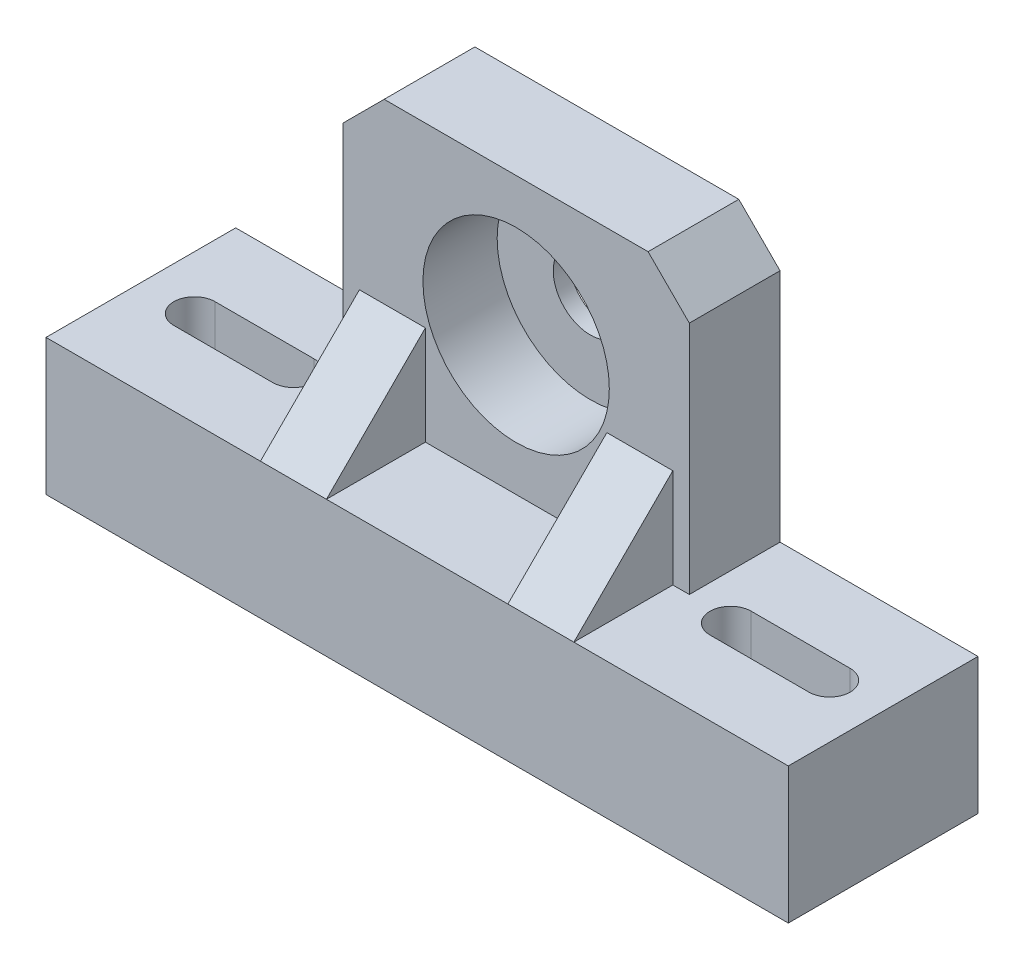
ISO-10303-21;
HEADER;
FILE_DESCRIPTION(('STEP AP214'),'2;1');
FILE_NAME('part.step','',(''),(''),'','','');
FILE_SCHEMA(('AUTOMOTIVE_DESIGN { 1 0 10303 214 1 1 1 1 }'));
ENDSEC;
DATA;
#1=APPLICATION_CONTEXT('core data for automotive mechanical design processes');
#2=APPLICATION_PROTOCOL_DEFINITION('international standard','automotive_design',2000,#1);
#3=PRODUCT_CONTEXT('',#1,'mechanical');
#4=PRODUCT('Part','Part','',(#3));
#5=PRODUCT_RELATED_PRODUCT_CATEGORY('part','',(#4));
#6=PRODUCT_DEFINITION_FORMATION('','',#4);
#7=PRODUCT_DEFINITION_CONTEXT('part definition',#1,'design');
#8=PRODUCT_DEFINITION('design','',#6,#7);
#9=PRODUCT_DEFINITION_SHAPE('','',#8);
#10=(LENGTH_UNIT() NAMED_UNIT(*) SI_UNIT(.MILLI.,.METRE.));
#11=(NAMED_UNIT(*) PLANE_ANGLE_UNIT() SI_UNIT($,.RADIAN.));
#12=(NAMED_UNIT(*) SI_UNIT($,.STERADIAN.) SOLID_ANGLE_UNIT());
#13=UNCERTAINTY_MEASURE_WITH_UNIT(LENGTH_MEASURE(1.E-05),#10,'distance_accuracy_value','');
#14=(GEOMETRIC_REPRESENTATION_CONTEXT(3) GLOBAL_UNCERTAINTY_ASSIGNED_CONTEXT((#13)) GLOBAL_UNIT_ASSIGNED_CONTEXT((#10,
#11,#12)) REPRESENTATION_CONTEXT('',''));
#15=CARTESIAN_POINT('',(0.,0.,0.));
#16=DIRECTION('',(0.,0.,1.));
#17=DIRECTION('',(1.,0.,0.));
#18=AXIS2_PLACEMENT_3D('',#15,#16,#17);
#19=CARTESIAN_POINT('',(0.,0.,-6.5));
#20=DIRECTION('',(0.,0.,1.));
#21=DIRECTION('',(1.,0.,0.));
#22=AXIS2_PLACEMENT_3D('',#19,#20,#21);
#23=CYLINDRICAL_SURFACE('',#22,4.5);
#24=CARTESIAN_POINT('',(0.,0.,-5.5));
#25=DIRECTION('',(0.,0.,1.));
#26=DIRECTION('',(1.,0.,0.));
#27=AXIS2_PLACEMENT_3D('',#24,#25,#26);
#28=CIRCLE('',#27,4.5);
#29=CARTESIAN_POINT('',(4.5,0.,-5.5));
#30=VERTEX_POINT('',#29);
#31=EDGE_CURVE('E303',#30,#30,#28,.T.);
#32=ORIENTED_EDGE('',*,*,#31,.F.);
#33=EDGE_LOOP('',(#32));
#34=FACE_BOUND('',#33,.T.);
#35=CARTESIAN_POINT('',(0.,0.,-3.5));
#36=DIRECTION('',(0.,0.,1.));
#37=DIRECTION('',(1.,0.,0.));
#38=AXIS2_PLACEMENT_3D('',#35,#36,#37);
#39=CIRCLE('',#38,4.5);
#40=CARTESIAN_POINT('',(4.5,0.,-3.5));
#41=VERTEX_POINT('',#40);
#42=EDGE_CURVE('E290',#41,#41,#39,.F.);
#43=ORIENTED_EDGE('',*,*,#42,.F.);
#44=EDGE_LOOP('',(#43));
#45=FACE_BOUND('',#44,.T.);
#46=ADVANCED_FACE('F41',(#34,#45),#23,.F.);
#47=CARTESIAN_POINT('',(0.,-16.75,5.5));
#48=DIRECTION('',(0.,1.,0.));
#49=DIRECTION('',(-1.,0.,0.));
#50=AXIS2_PLACEMENT_3D('',#47,#48,#49);
#51=PLANE('',#50);
#52=DIRECTION('',(1.,0.,0.));
#53=VECTOR('',#52,1.);
#54=CARTESIAN_POINT('',(0.,-16.75,5.5));
#55=LINE('',#54,#53);
#56=CARTESIAN_POINT('',(-11.,-16.75,5.5));
#57=VERTEX_POINT('',#56);
#58=CARTESIAN_POINT('',(11.,-16.75,5.5));
#59=VERTEX_POINT('',#58);
#60=EDGE_CURVE('E374',#57,#59,#55,.T.);
#61=ORIENTED_EDGE('',*,*,#60,.F.);
#62=DIRECTION('',(0.,0.,1.));
#63=VECTOR('',#62,1.);
#64=CARTESIAN_POINT('',(-11.,-16.75,5.5));
#65=LINE('',#64,#63);
#66=CARTESIAN_POINT('',(-11.,-16.75,17.5));
#67=VERTEX_POINT('',#66);
#68=EDGE_CURVE('E298',#57,#67,#65,.T.);
#69=ORIENTED_EDGE('',*,*,#68,.T.);
#70=DIRECTION('',(1.,0.,0.));
#71=VECTOR('',#70,1.);
#72=CARTESIAN_POINT('',(0.,-16.75,17.5));
#73=LINE('',#72,#71);
#74=CARTESIAN_POINT('',(11.,-16.75,17.5));
#75=VERTEX_POINT('',#74);
#76=EDGE_CURVE('E356',#67,#75,#73,.T.);
#77=ORIENTED_EDGE('',*,*,#76,.T.);
#78=DIRECTION('',(0.,0.,-1.));
#79=VECTOR('',#78,1.);
#80=CARTESIAN_POINT('',(11.,-16.75,5.5));
#81=LINE('',#80,#79);
#82=EDGE_CURVE('E327',#75,#59,#81,.T.);
#83=ORIENTED_EDGE('',*,*,#82,.T.);
#84=EDGE_LOOP('',(#61,#69,#77,#83));
#85=FACE_BOUND('',#84,.T.);
#86=ADVANCED_FACE('F533',(#85),#51,.T.);
#87=CARTESIAN_POINT('',(-38.5,-16.75,6.));
#88=DIRECTION('',(0.,1.,0.));
#89=DIRECTION('',(-1.,0.,0.));
#90=AXIS2_PLACEMENT_3D('',#87,#88,#89);
#91=CIRCLE('',#90,2.5);
#92=CARTESIAN_POINT('',(-38.5,-16.75,3.5));
#93=VERTEX_POINT('',#92);
#94=CARTESIAN_POINT('',(-38.5,-16.75,8.5));
#95=VERTEX_POINT('',#94);
#96=EDGE_CURVE('E282',#93,#95,#91,.T.);
#97=ORIENTED_EDGE('',*,*,#96,.F.);
#98=DIRECTION('',(-1.,0.,0.));
#99=VECTOR('',#98,1.);
#100=CARTESIAN_POINT('',(0.,-16.75,3.5));
#101=LINE('',#100,#99);
#102=CARTESIAN_POINT('',(-26.5,-16.75,3.5));
#103=VERTEX_POINT('',#102);
#104=EDGE_CURVE('E242',#103,#93,#101,.T.);
#105=ORIENTED_EDGE('',*,*,#104,.F.);
#106=CARTESIAN_POINT('',(-26.5,-16.75,6.));
#107=DIRECTION('',(0.,1.,0.));
#108=DIRECTION('',(-1.,0.,0.));
#109=AXIS2_PLACEMENT_3D('',#106,#107,#108);
#110=CIRCLE('',#109,2.5);
#111=CARTESIAN_POINT('',(-26.5,-16.75,8.5));
#112=VERTEX_POINT('',#111);
#113=EDGE_CURVE('E212',#112,#103,#110,.T.);
#114=ORIENTED_EDGE('',*,*,#113,.F.);
#115=DIRECTION('',(1.,0.,0.));
#116=VECTOR('',#115,1.);
#117=CARTESIAN_POINT('',(0.,-16.75,8.5));
#118=LINE('',#117,#116);
#119=EDGE_CURVE('E279',#95,#112,#118,.T.);
#120=ORIENTED_EDGE('',*,*,#119,.F.);
#121=EDGE_LOOP('',(#97,#105,#114,#120));
#122=FACE_BOUND('',#121,.T.);
#123=DIRECTION('',(0.,0.,1.));
#124=VECTOR('',#123,1.);
#125=CARTESIAN_POINT('',(-19.,-16.75,5.5));
#126=LINE('',#125,#124);
#127=CARTESIAN_POINT('',(-19.,-16.75,5.5));
#128=VERTEX_POINT('',#127);
#129=CARTESIAN_POINT('',(-19.,-16.75,17.5));
#130=VERTEX_POINT('',#129);
#131=EDGE_CURVE('E310',#128,#130,#126,.T.);
#132=ORIENTED_EDGE('',*,*,#131,.F.);
#133=CARTESIAN_POINT('',(-21.,-16.75,5.5));
#134=VERTEX_POINT('',#133);
#135=EDGE_CURVE('E369',#134,#128,#55,.T.);
#136=ORIENTED_EDGE('',*,*,#135,.F.);
#137=DIRECTION('',(0.,0.,-1.));
#138=VECTOR('',#137,1.);
#139=CARTESIAN_POINT('',(-21.,-16.75,5.5));
#140=LINE('',#139,#138);
#141=CARTESIAN_POINT('',(-21.,-16.75,-5.5));
#142=VERTEX_POINT('',#141);
#143=EDGE_CURVE('E428',#134,#142,#140,.T.);
#144=ORIENTED_EDGE('',*,*,#143,.T.);
#145=DIRECTION('',(1.,0.,0.));
#146=VECTOR('',#145,1.);
#147=CARTESIAN_POINT('',(0.,-16.75,-5.5));
#148=LINE('',#147,#146);
#149=CARTESIAN_POINT('',(-45.,-16.75,-5.5));
#150=VERTEX_POINT('',#149);
#151=EDGE_CURVE('E391',#150,#142,#148,.T.);
#152=ORIENTED_EDGE('',*,*,#151,.F.);
#153=DIRECTION('',(0.,0.,-1.));
#154=VECTOR('',#153,1.);
#155=CARTESIAN_POINT('',(-45.,-16.75,5.5));
#156=LINE('',#155,#154);
#157=CARTESIAN_POINT('',(-45.,-16.75,17.5));
#158=VERTEX_POINT('',#157);
#159=EDGE_CURVE('E425',#158,#150,#156,.T.);
#160=ORIENTED_EDGE('',*,*,#159,.F.);
#161=EDGE_CURVE('E350',#158,#130,#73,.T.);
#162=ORIENTED_EDGE('',*,*,#161,.T.);
#163=EDGE_LOOP('',(#132,#136,#144,#152,#160,#162));
#164=FACE_BOUND('',#163,.T.);
#165=ADVANCED_FACE('F520',(#122,#164),#51,.T.);
#166=CARTESIAN_POINT('',(0.,0.,5.5));
#167=DIRECTION('',(0.,0.,1.));
#168=DIRECTION('',(1.,0.,0.));
#169=AXIS2_PLACEMENT_3D('',#166,#167,#168);
#170=PLANE('',#169);
#171=CARTESIAN_POINT('',(0.,0.,5.5));
#172=DIRECTION('',(0.,0.,1.));
#173=DIRECTION('',(1.,0.,0.));
#174=AXIS2_PLACEMENT_3D('',#171,#172,#173);
#175=CIRCLE('',#174,11.3);
#176=CARTESIAN_POINT('',(11.3,0.,5.5));
#177=VERTEX_POINT('',#176);
#178=EDGE_CURVE('E285',#177,#177,#175,.T.);
#179=ORIENTED_EDGE('',*,*,#178,.F.);
#180=EDGE_LOOP('',(#179));
#181=FACE_BOUND('',#180,.T.);
#182=DIRECTION('',(1.,0.,0.));
#183=VECTOR('',#182,1.);
#184=CARTESIAN_POINT('',(0.,16.75,5.5));
#185=LINE('',#184,#183);
#186=CARTESIAN_POINT('',(-16.,16.75,5.5));
#187=VERTEX_POINT('',#186);
#188=CARTESIAN_POINT('',(16.,16.75,5.5));
#189=VERTEX_POINT('',#188);
#190=EDGE_CURVE('E384',#187,#189,#185,.T.);
#191=ORIENTED_EDGE('',*,*,#190,.F.);
#192=DIRECTION('',(0.707106781186549,0.707106781186547,0.));
#193=VECTOR('',#192,1.);
#194=CARTESIAN_POINT('',(-16.375,16.375,5.5));
#195=LINE('',#194,#193);
#196=CARTESIAN_POINT('',(-21.,11.75,5.5));
#197=VERTEX_POINT('',#196);
#198=EDGE_CURVE('E50',#187,#197,#195,.F.);
#199=ORIENTED_EDGE('',*,*,#198,.T.);
#200=DIRECTION('',(0.,1.,0.));
#201=VECTOR('',#200,1.);
#202=CARTESIAN_POINT('',(-21.,0.,5.5));
#203=LINE('',#202,#201);
#204=EDGE_CURVE('E376',#134,#197,#203,.T.);
#205=ORIENTED_EDGE('',*,*,#204,.F.);
#206=ORIENTED_EDGE('',*,*,#135,.T.);
#207=DIRECTION('',(0.,-1.,0.));
#208=VECTOR('',#207,1.);
#209=CARTESIAN_POINT('',(-19.,0.,5.5));
#210=LINE('',#209,#208);
#211=CARTESIAN_POINT('',(-19.,-4.75000000000012,5.5));
#212=VERTEX_POINT('',#211);
#213=EDGE_CURVE('E314',#212,#128,#210,.T.);
#214=ORIENTED_EDGE('',*,*,#213,.F.);
#215=DIRECTION('',(1.,0.,0.));
#216=VECTOR('',#215,1.);
#217=CARTESIAN_POINT('',(0.,-4.75000000000012,5.5));
#218=LINE('',#217,#216);
#219=CARTESIAN_POINT('',(-11.,-4.75000000000012,5.5));
#220=VERTEX_POINT('',#219);
#221=EDGE_CURVE('E318',#220,#212,#218,.F.);
#222=ORIENTED_EDGE('',*,*,#221,.F.);
#223=DIRECTION('',(0.,-1.,0.));
#224=VECTOR('',#223,1.);
#225=CARTESIAN_POINT('',(-11.,0.,5.5));
#226=LINE('',#225,#224);
#227=EDGE_CURVE('E307',#220,#57,#226,.T.);
#228=ORIENTED_EDGE('',*,*,#227,.T.);
#229=ORIENTED_EDGE('',*,*,#60,.T.);
#230=DIRECTION('',(0.,1.,0.));
#231=VECTOR('',#230,1.);
#232=CARTESIAN_POINT('',(11.,0.,5.5));
#233=LINE('',#232,#231);
#234=CARTESIAN_POINT('',(11.,-4.75000000000012,5.5));
#235=VERTEX_POINT('',#234);
#236=EDGE_CURVE('E334',#59,#235,#233,.T.);
#237=ORIENTED_EDGE('',*,*,#236,.T.);
#238=DIRECTION('',(-1.,0.,0.));
#239=VECTOR('',#238,1.);
#240=CARTESIAN_POINT('',(0.,-4.75000000000012,5.5));
#241=LINE('',#240,#239);
#242=CARTESIAN_POINT('',(19.,-4.75000000000012,5.5));
#243=VERTEX_POINT('',#242);
#244=EDGE_CURVE('E345',#243,#235,#241,.T.);
#245=ORIENTED_EDGE('',*,*,#244,.F.);
#246=DIRECTION('',(0.,1.,0.));
#247=VECTOR('',#246,1.);
#248=CARTESIAN_POINT('',(19.,0.,5.5));
#249=LINE('',#248,#247);
#250=CARTESIAN_POINT('',(19.,-16.75,5.5));
#251=VERTEX_POINT('',#250);
#252=EDGE_CURVE('E341',#251,#243,#249,.T.);
#253=ORIENTED_EDGE('',*,*,#252,.F.);
#254=CARTESIAN_POINT('',(21.,-16.75,5.5));
#255=VERTEX_POINT('',#254);
#256=EDGE_CURVE('E375',#251,#255,#55,.T.);
#257=ORIENTED_EDGE('',*,*,#256,.T.);
#258=DIRECTION('',(0.,1.,0.));
#259=VECTOR('',#258,1.);
#260=CARTESIAN_POINT('',(21.,0.,5.5));
#261=LINE('',#260,#259);
#262=CARTESIAN_POINT('',(21.,11.75,5.5));
#263=VERTEX_POINT('',#262);
#264=EDGE_CURVE('E380',#255,#263,#261,.T.);
#265=ORIENTED_EDGE('',*,*,#264,.T.);
#266=DIRECTION('',(-0.707106781186547,0.707106781186549,0.));
#267=VECTOR('',#266,1.);
#268=CARTESIAN_POINT('',(16.375,16.375,5.5));
#269=LINE('',#268,#267);
#270=EDGE_CURVE('E62',#263,#189,#269,.T.);
#271=ORIENTED_EDGE('',*,*,#270,.T.);
#272=EDGE_LOOP('',(#191,#199,#205,#206,#214,#222,#228,#229,#237,#245,#253,#257,#265,#271));
#273=FACE_BOUND('',#272,.T.);
#274=ADVANCED_FACE('F470',(#181,#273),#170,.T.);
#275=CARTESIAN_POINT('',(-21.,0.,5.5));
#276=DIRECTION('',(-1.,0.,0.));
#277=DIRECTION('',(0.,0.,1.));
#278=AXIS2_PLACEMENT_3D('',#275,#276,#277);
#279=PLANE('',#278);
#280=ORIENTED_EDGE('',*,*,#204,.T.);
#281=DIRECTION('',(0.,0.,-1.));
#282=VECTOR('',#281,1.);
#283=CARTESIAN_POINT('',(-21.,11.75,5.5));
#284=LINE('',#283,#282);
#285=CARTESIAN_POINT('',(-21.,11.75,-5.5));
#286=VERTEX_POINT('',#285);
#287=EDGE_CURVE('E449',#197,#286,#284,.T.);
#288=ORIENTED_EDGE('',*,*,#287,.T.);
#289=DIRECTION('',(0.,1.,0.));
#290=VECTOR('',#289,1.);
#291=CARTESIAN_POINT('',(-21.,0.,-5.5));
#292=LINE('',#291,#290);
#293=EDGE_CURVE('E368',#142,#286,#292,.T.);
#294=ORIENTED_EDGE('',*,*,#293,.F.);
#295=ORIENTED_EDGE('',*,*,#143,.F.);
#296=EDGE_LOOP('',(#280,#288,#294,#295));
#297=FACE_BOUND('',#296,.T.);
#298=ADVANCED_FACE('F476',(#297),#279,.T.);
#299=CARTESIAN_POINT('',(-45.,0.,5.5));
#300=DIRECTION('',(1.,0.,0.));
#301=DIRECTION('',(0.,1.,0.));
#302=AXIS2_PLACEMENT_3D('',#299,#300,#301);
#303=PLANE('',#302);
#304=DIRECTION('',(0.,-1.,0.));
#305=VECTOR('',#304,1.);
#306=CARTESIAN_POINT('',(-45.,0.,-5.5));
#307=LINE('',#306,#305);
#308=CARTESIAN_POINT('',(-45.,-33.25,-5.5));
#309=VERTEX_POINT('',#308);
#310=EDGE_CURVE('E395',#150,#309,#307,.T.);
#311=ORIENTED_EDGE('',*,*,#310,.T.);
#312=DIRECTION('',(0.,0.,-1.));
#313=VECTOR('',#312,1.);
#314=CARTESIAN_POINT('',(-45.,-33.25,5.5));
#315=LINE('',#314,#313);
#316=CARTESIAN_POINT('',(-45.,-33.25,17.5));
#317=VERTEX_POINT('',#316);
#318=EDGE_CURVE('E421',#317,#309,#315,.T.);
#319=ORIENTED_EDGE('',*,*,#318,.F.);
#320=DIRECTION('',(0.,-1.,0.));
#321=VECTOR('',#320,1.);
#322=CARTESIAN_POINT('',(-45.,0.,17.5));
#323=LINE('',#322,#321);
#324=EDGE_CURVE('E354',#158,#317,#323,.T.);
#325=ORIENTED_EDGE('',*,*,#324,.F.);
#326=ORIENTED_EDGE('',*,*,#159,.T.);
#327=EDGE_LOOP('',(#311,#319,#325,#326));
#328=FACE_BOUND('',#327,.T.);
#329=ADVANCED_FACE('F642',(#328),#303,.F.);
#330=CARTESIAN_POINT('',(0.,-33.25,5.5));
#331=DIRECTION('',(0.,1.,0.));
#332=DIRECTION('',(0.,0.,1.));
#333=AXIS2_PLACEMENT_3D('',#330,#331,#332);
#334=PLANE('',#333);
#335=DIRECTION('',(1.,0.,0.));
#336=VECTOR('',#335,1.);
#337=CARTESIAN_POINT('',(-38.5,-33.25,3.5));
#338=LINE('',#337,#336);
#339=CARTESIAN_POINT('',(-38.5,-33.25,3.5));
#340=VERTEX_POINT('',#339);
#341=CARTESIAN_POINT('',(-26.5,-33.25,3.5));
#342=VERTEX_POINT('',#341);
#343=EDGE_CURVE('E221',#340,#342,#338,.T.);
#344=ORIENTED_EDGE('',*,*,#343,.F.);
#345=CARTESIAN_POINT('',(-38.5,-33.25,6.));
#346=DIRECTION('',(0.,-1.,0.));
#347=DIRECTION('',(0.,0.,-1.));
#348=AXIS2_PLACEMENT_3D('',#345,#346,#347);
#349=CIRCLE('',#348,2.5);
#350=CARTESIAN_POINT('',(-38.5,-33.25,8.5));
#351=VERTEX_POINT('',#350);
#352=EDGE_CURVE('E227',#351,#340,#349,.T.);
#353=ORIENTED_EDGE('',*,*,#352,.F.);
#354=DIRECTION('',(-1.,0.,0.));
#355=VECTOR('',#354,1.);
#356=CARTESIAN_POINT('',(-38.5,-33.25,8.5));
#357=LINE('',#356,#355);
#358=CARTESIAN_POINT('',(-26.5,-33.25,8.5));
#359=VERTEX_POINT('',#358);
#360=EDGE_CURVE('E232',#359,#351,#357,.T.);
#361=ORIENTED_EDGE('',*,*,#360,.F.);
#362=CARTESIAN_POINT('',(-26.5,-33.25,6.));
#363=DIRECTION('',(0.,-1.,0.));
#364=DIRECTION('',(0.,0.,-1.));
#365=AXIS2_PLACEMENT_3D('',#362,#363,#364);
#366=CIRCLE('',#365,2.5);
#367=EDGE_CURVE('E209',#342,#359,#366,.T.);
#368=ORIENTED_EDGE('',*,*,#367,.F.);
#369=EDGE_LOOP('',(#344,#353,#361,#368));
#370=FACE_BOUND('',#369,.T.);
#371=DIRECTION('',(-1.,0.,0.));
#372=VECTOR('',#371,1.);
#373=CARTESIAN_POINT('',(38.5,-33.25,8.5));
#374=LINE('',#373,#372);
#375=CARTESIAN_POINT('',(38.5,-33.25,8.5));
#376=VERTEX_POINT('',#375);
#377=CARTESIAN_POINT('',(26.5,-33.25,8.5));
#378=VERTEX_POINT('',#377);
#379=EDGE_CURVE('E250',#376,#378,#374,.T.);
#380=ORIENTED_EDGE('',*,*,#379,.F.);
#381=CARTESIAN_POINT('',(38.5,-33.25,6.));
#382=DIRECTION('',(0.,-1.,0.));
#383=DIRECTION('',(0.,0.,1.));
#384=AXIS2_PLACEMENT_3D('',#381,#382,#383);
#385=CIRCLE('',#384,2.5);
#386=CARTESIAN_POINT('',(38.5,-33.25,3.5));
#387=VERTEX_POINT('',#386);
#388=EDGE_CURVE('E247',#387,#376,#385,.T.);
#389=ORIENTED_EDGE('',*,*,#388,.F.);
#390=DIRECTION('',(1.,0.,0.));
#391=VECTOR('',#390,1.);
#392=CARTESIAN_POINT('',(38.5,-33.25,3.5));
#393=LINE('',#392,#391);
#394=CARTESIAN_POINT('',(26.5,-33.25,3.5));
#395=VERTEX_POINT('',#394);
#396=EDGE_CURVE('E258',#395,#387,#393,.T.);
#397=ORIENTED_EDGE('',*,*,#396,.F.);
#398=CARTESIAN_POINT('',(26.5,-33.25,6.));
#399=DIRECTION('',(0.,-1.,0.));
#400=DIRECTION('',(0.,0.,1.));
#401=AXIS2_PLACEMENT_3D('',#398,#399,#400);
#402=CIRCLE('',#401,2.5);
#403=EDGE_CURVE('E254',#378,#395,#402,.T.);
#404=ORIENTED_EDGE('',*,*,#403,.F.);
#405=EDGE_LOOP('',(#380,#389,#397,#404));
#406=FACE_BOUND('',#405,.T.);
#407=DIRECTION('',(1.,0.,0.));
#408=VECTOR('',#407,1.);
#409=CARTESIAN_POINT('',(0.,-33.25,-5.5));
#410=LINE('',#409,#408);
#411=CARTESIAN_POINT('',(45.,-33.25,-5.5));
#412=VERTEX_POINT('',#411);
#413=EDGE_CURVE('E399',#309,#412,#410,.T.);
#414=ORIENTED_EDGE('',*,*,#413,.T.);
#415=DIRECTION('',(0.,0.,-1.));
#416=VECTOR('',#415,1.);
#417=CARTESIAN_POINT('',(45.,-33.25,5.5));
#418=LINE('',#417,#416);
#419=CARTESIAN_POINT('',(45.,-33.25,17.5));
#420=VERTEX_POINT('',#419);
#421=EDGE_CURVE('E417',#420,#412,#418,.T.);
#422=ORIENTED_EDGE('',*,*,#421,.F.);
#423=DIRECTION('',(1.,0.,0.));
#424=VECTOR('',#423,1.);
#425=CARTESIAN_POINT('',(0.,-33.25,17.5));
#426=LINE('',#425,#424);
#427=EDGE_CURVE('E361',#317,#420,#426,.T.);
#428=ORIENTED_EDGE('',*,*,#427,.F.);
#429=ORIENTED_EDGE('',*,*,#318,.T.);
#430=EDGE_LOOP('',(#414,#422,#428,#429));
#431=FACE_BOUND('',#430,.T.);
#432=ADVANCED_FACE('F229',(#370,#406,#431),#334,.F.);
#433=CARTESIAN_POINT('',(45.,0.,5.5));
#434=DIRECTION('',(1.,0.,0.));
#435=DIRECTION('',(0.,1.,0.));
#436=AXIS2_PLACEMENT_3D('',#433,#434,#435);
#437=PLANE('',#436);
#438=DIRECTION('',(0.,-1.,0.));
#439=VECTOR('',#438,1.);
#440=CARTESIAN_POINT('',(45.,0.,-5.5));
#441=LINE('',#440,#439);
#442=CARTESIAN_POINT('',(45.,-16.75,-5.5));
#443=VERTEX_POINT('',#442);
#444=EDGE_CURVE('E402',#443,#412,#441,.T.);
#445=ORIENTED_EDGE('',*,*,#444,.F.);
#446=DIRECTION('',(0.,0.,-1.));
#447=VECTOR('',#446,1.);
#448=CARTESIAN_POINT('',(45.,-16.75,5.5));
#449=LINE('',#448,#447);
#450=CARTESIAN_POINT('',(45.,-16.75,17.5));
#451=VERTEX_POINT('',#450);
#452=EDGE_CURVE('E414',#451,#443,#449,.T.);
#453=ORIENTED_EDGE('',*,*,#452,.F.);
#454=DIRECTION('',(0.,1.,0.));
#455=VECTOR('',#454,1.);
#456=CARTESIAN_POINT('',(45.,0.,17.5));
#457=LINE('',#456,#455);
#458=EDGE_CURVE('E364',#420,#451,#457,.T.);
#459=ORIENTED_EDGE('',*,*,#458,.F.);
#460=ORIENTED_EDGE('',*,*,#421,.T.);
#461=EDGE_LOOP('',(#445,#453,#459,#460));
#462=FACE_BOUND('',#461,.T.);
#463=ADVANCED_FACE('F508',(#462),#437,.T.);
#464=CARTESIAN_POINT('',(38.5,-16.75,6.));
#465=DIRECTION('',(0.,1.,0.));
#466=DIRECTION('',(-1.,0.,0.));
#467=AXIS2_PLACEMENT_3D('',#464,#465,#466);
#468=CIRCLE('',#467,2.5);
#469=CARTESIAN_POINT('',(38.5,-16.75,8.5));
#470=VERTEX_POINT('',#469);
#471=CARTESIAN_POINT('',(38.5,-16.75,3.5));
#472=VERTEX_POINT('',#471);
#473=EDGE_CURVE('E446',#470,#472,#468,.T.);
#474=ORIENTED_EDGE('',*,*,#473,.F.);
#475=DIRECTION('',(1.,0.,0.));
#476=VECTOR('',#475,1.);
#477=CARTESIAN_POINT('',(0.,-16.75,8.5));
#478=LINE('',#477,#476);
#479=CARTESIAN_POINT('',(26.5,-16.75,8.5));
#480=VERTEX_POINT('',#479);
#481=EDGE_CURVE('E373',#480,#470,#478,.T.);
#482=ORIENTED_EDGE('',*,*,#481,.F.);
#483=CARTESIAN_POINT('',(26.5,-16.75,6.));
#484=DIRECTION('',(0.,1.,0.));
#485=DIRECTION('',(-1.,0.,0.));
#486=AXIS2_PLACEMENT_3D('',#483,#484,#485);
#487=CIRCLE('',#486,2.5);
#488=CARTESIAN_POINT('',(26.5,-16.75,3.5));
#489=VERTEX_POINT('',#488);
#490=EDGE_CURVE('E439',#489,#480,#487,.T.);
#491=ORIENTED_EDGE('',*,*,#490,.F.);
#492=DIRECTION('',(-1.,0.,0.));
#493=VECTOR('',#492,1.);
#494=CARTESIAN_POINT('',(0.,-16.75,3.5));
#495=LINE('',#494,#493);
#496=EDGE_CURVE('E443',#472,#489,#495,.T.);
#497=ORIENTED_EDGE('',*,*,#496,.F.);
#498=EDGE_LOOP('',(#474,#482,#491,#497));
#499=FACE_BOUND('',#498,.T.);
#500=DIRECTION('',(0.,0.,-1.));
#501=VECTOR('',#500,1.);
#502=CARTESIAN_POINT('',(19.,-16.75,5.5));
#503=LINE('',#502,#501);
#504=CARTESIAN_POINT('',(19.,-16.75,17.5));
#505=VERTEX_POINT('',#504);
#506=EDGE_CURVE('E337',#505,#251,#503,.T.);
#507=ORIENTED_EDGE('',*,*,#506,.F.);
#508=EDGE_CURVE('E349',#505,#451,#73,.T.);
#509=ORIENTED_EDGE('',*,*,#508,.T.);
#510=ORIENTED_EDGE('',*,*,#452,.T.);
#511=CARTESIAN_POINT('',(21.,-16.75,-5.5));
#512=VERTEX_POINT('',#511);
#513=EDGE_CURVE('E396',#512,#443,#148,.T.);
#514=ORIENTED_EDGE('',*,*,#513,.F.);
#515=DIRECTION('',(0.,0.,-1.));
#516=VECTOR('',#515,1.);
#517=CARTESIAN_POINT('',(21.,-16.75,5.5));
#518=LINE('',#517,#516);
#519=EDGE_CURVE('E387',#255,#512,#518,.T.);
#520=ORIENTED_EDGE('',*,*,#519,.F.);
#521=ORIENTED_EDGE('',*,*,#256,.F.);
#522=EDGE_LOOP('',(#507,#509,#510,#514,#520,#521));
#523=FACE_BOUND('',#522,.T.);
#524=ADVANCED_FACE('F494',(#499,#523),#51,.T.);
#525=CARTESIAN_POINT('',(21.,0.,5.5));
#526=DIRECTION('',(-1.,0.,0.));
#527=DIRECTION('',(0.,0.,1.));
#528=AXIS2_PLACEMENT_3D('',#525,#526,#527);
#529=PLANE('',#528);
#530=DIRECTION('',(0.,1.,0.));
#531=VECTOR('',#530,1.);
#532=CARTESIAN_POINT('',(21.,0.,-5.5));
#533=LINE('',#532,#531);
#534=CARTESIAN_POINT('',(21.,11.75,-5.5));
#535=VERTEX_POINT('',#534);
#536=EDGE_CURVE('E406',#512,#535,#533,.T.);
#537=ORIENTED_EDGE('',*,*,#536,.T.);
#538=DIRECTION('',(0.,0.,1.));
#539=VECTOR('',#538,1.);
#540=CARTESIAN_POINT('',(21.,11.75,5.5));
#541=LINE('',#540,#539);
#542=EDGE_CURVE('E11',#535,#263,#541,.T.);
#543=ORIENTED_EDGE('',*,*,#542,.T.);
#544=ORIENTED_EDGE('',*,*,#264,.F.);
#545=ORIENTED_EDGE('',*,*,#519,.T.);
#546=EDGE_LOOP('',(#537,#543,#544,#545));
#547=FACE_BOUND('',#546,.T.);
#548=ADVANCED_FACE('F489',(#547),#529,.F.);
#549=CARTESIAN_POINT('',(0.,16.75,5.5));
#550=DIRECTION('',(0.,1.,0.));
#551=DIRECTION('',(0.,0.,1.));
#552=AXIS2_PLACEMENT_3D('',#549,#550,#551);
#553=PLANE('',#552);
#554=DIRECTION('',(1.,0.,0.));
#555=VECTOR('',#554,1.);
#556=CARTESIAN_POINT('',(0.,16.75,-5.5));
#557=LINE('',#556,#555);
#558=CARTESIAN_POINT('',(-16.,16.75,-5.5));
#559=VERTEX_POINT('',#558);
#560=CARTESIAN_POINT('',(16.,16.75,-5.5));
#561=VERTEX_POINT('',#560);
#562=EDGE_CURVE('E381',#559,#561,#557,.T.);
#563=ORIENTED_EDGE('',*,*,#562,.F.);
#564=DIRECTION('',(0.,0.,1.));
#565=VECTOR('',#564,1.);
#566=CARTESIAN_POINT('',(-16.,16.75,5.5));
#567=LINE('',#566,#565);
#568=EDGE_CURVE('E463',#559,#187,#567,.T.);
#569=ORIENTED_EDGE('',*,*,#568,.T.);
#570=ORIENTED_EDGE('',*,*,#190,.T.);
#571=DIRECTION('',(0.,0.,-1.));
#572=VECTOR('',#571,1.);
#573=CARTESIAN_POINT('',(16.,16.75,-5.5));
#574=LINE('',#573,#572);
#575=EDGE_CURVE('E459',#189,#561,#574,.T.);
#576=ORIENTED_EDGE('',*,*,#575,.T.);
#577=EDGE_LOOP('',(#563,#569,#570,#576));
#578=FACE_BOUND('',#577,.T.);
#579=ADVANCED_FACE('F483',(#578),#553,.T.);
#580=CARTESIAN_POINT('',(0.,0.,-5.5));
#581=DIRECTION('',(0.,0.,1.));
#582=DIRECTION('',(1.,0.,0.));
#583=AXIS2_PLACEMENT_3D('',#580,#581,#582);
#584=PLANE('',#583);
#585=ORIENTED_EDGE('',*,*,#31,.T.);
#586=EDGE_LOOP('',(#585));
#587=FACE_BOUND('',#586,.T.);
#588=ORIENTED_EDGE('',*,*,#293,.T.);
#589=DIRECTION('',(-0.707106781186549,-0.707106781186547,0.));
#590=VECTOR('',#589,1.);
#591=CARTESIAN_POINT('',(-21.,11.75,-5.5));
#592=LINE('',#591,#590);
#593=EDGE_CURVE('E456',#286,#559,#592,.F.);
#594=ORIENTED_EDGE('',*,*,#593,.T.);
#595=ORIENTED_EDGE('',*,*,#562,.T.);
#596=DIRECTION('',(0.707106781186547,-0.707106781186549,0.));
#597=VECTOR('',#596,1.);
#598=CARTESIAN_POINT('',(16.,16.75,-5.5));
#599=LINE('',#598,#597);
#600=EDGE_CURVE('E453',#561,#535,#599,.T.);
#601=ORIENTED_EDGE('',*,*,#600,.T.);
#602=ORIENTED_EDGE('',*,*,#536,.F.);
#603=ORIENTED_EDGE('',*,*,#513,.T.);
#604=ORIENTED_EDGE('',*,*,#444,.T.);
#605=ORIENTED_EDGE('',*,*,#413,.F.);
#606=ORIENTED_EDGE('',*,*,#310,.F.);
#607=ORIENTED_EDGE('',*,*,#151,.T.);
#608=EDGE_LOOP('',(#588,#594,#595,#601,#602,#603,#604,#605,#606,#607));
#609=FACE_BOUND('',#608,.T.);
#610=ADVANCED_FACE('F481',(#587,#609),#584,.F.);
#611=CARTESIAN_POINT('',(0.,0.,17.5));
#612=DIRECTION('',(0.,0.,1.));
#613=DIRECTION('',(1.,0.,0.));
#614=AXIS2_PLACEMENT_3D('',#611,#612,#613);
#615=PLANE('',#614);
#616=ORIENTED_EDGE('',*,*,#427,.T.);
#617=ORIENTED_EDGE('',*,*,#458,.T.);
#618=ORIENTED_EDGE('',*,*,#508,.F.);
#619=EDGE_CURVE('E357',#75,#505,#73,.T.);
#620=ORIENTED_EDGE('',*,*,#619,.F.);
#621=ORIENTED_EDGE('',*,*,#76,.F.);
#622=EDGE_CURVE('E355',#130,#67,#73,.T.);
#623=ORIENTED_EDGE('',*,*,#622,.F.);
#624=ORIENTED_EDGE('',*,*,#161,.F.);
#625=ORIENTED_EDGE('',*,*,#324,.T.);
#626=EDGE_LOOP('',(#616,#617,#618,#620,#621,#623,#624,#625));
#627=FACE_BOUND('',#626,.T.);
#628=ADVANCED_FACE('F509',(#627),#615,.T.);
#629=CARTESIAN_POINT('',(15.,-4.75000000000012,5.5));
#630=DIRECTION('',(0.,0.707106781186551,0.707106781186544));
#631=DIRECTION('',(0.,-0.707106781186544,0.707106781186551));
#632=AXIS2_PLACEMENT_3D('',#629,#630,#631);
#633=PLANE('',#632);
#634=DIRECTION('',(0.,-0.707106781186544,0.707106781186551));
#635=VECTOR('',#634,1.);
#636=CARTESIAN_POINT('',(19.,-4.75000000000012,5.5));
#637=LINE('',#636,#635);
#638=EDGE_CURVE('E323',#243,#505,#637,.T.);
#639=ORIENTED_EDGE('',*,*,#638,.F.);
#640=ORIENTED_EDGE('',*,*,#244,.T.);
#641=DIRECTION('',(0.,-0.707106781186544,0.707106781186551));
#642=VECTOR('',#641,1.);
#643=CARTESIAN_POINT('',(11.,-4.75000000000012,5.5));
#644=LINE('',#643,#642);
#645=EDGE_CURVE('E322',#235,#75,#644,.T.);
#646=ORIENTED_EDGE('',*,*,#645,.T.);
#647=ORIENTED_EDGE('',*,*,#619,.T.);
#648=EDGE_LOOP('',(#639,#640,#646,#647));
#649=FACE_BOUND('',#648,.T.);
#650=ADVANCED_FACE('F542',(#649),#633,.T.);
#651=CARTESIAN_POINT('',(19.,-8.25,6.));
#652=DIRECTION('',(1.,0.,0.));
#653=DIRECTION('',(0.,0.,-1.));
#654=AXIS2_PLACEMENT_3D('',#651,#652,#653);
#655=PLANE('',#654);
#656=ORIENTED_EDGE('',*,*,#506,.T.);
#657=ORIENTED_EDGE('',*,*,#252,.T.);
#658=ORIENTED_EDGE('',*,*,#638,.T.);
#659=EDGE_LOOP('',(#656,#657,#658));
#660=FACE_BOUND('',#659,.T.);
#661=ADVANCED_FACE('F540',(#660),#655,.T.);
#662=CARTESIAN_POINT('',(11.,-8.25,6.));
#663=DIRECTION('',(1.,0.,0.));
#664=DIRECTION('',(0.,0.,-1.));
#665=AXIS2_PLACEMENT_3D('',#662,#663,#664);
#666=PLANE('',#665);
#667=ORIENTED_EDGE('',*,*,#236,.F.);
#668=ORIENTED_EDGE('',*,*,#82,.F.);
#669=ORIENTED_EDGE('',*,*,#645,.F.);
#670=EDGE_LOOP('',(#667,#668,#669));
#671=FACE_BOUND('',#670,.T.);
#672=ADVANCED_FACE('F545',(#671),#666,.F.);
#673=CARTESIAN_POINT('',(-15.,-4.75000000000012,5.5));
#674=DIRECTION('',(0.,-0.707106781186551,-0.707106781186544));
#675=DIRECTION('',(0.,-0.707106781186544,0.707106781186551));
#676=AXIS2_PLACEMENT_3D('',#673,#674,#675);
#677=PLANE('',#676);
#678=DIRECTION('',(0.,-0.707106781186544,0.707106781186551));
#679=VECTOR('',#678,1.);
#680=CARTESIAN_POINT('',(-11.,-4.75000000000012,5.5));
#681=LINE('',#680,#679);
#682=EDGE_CURVE('E299',#220,#67,#681,.T.);
#683=ORIENTED_EDGE('',*,*,#682,.F.);
#684=ORIENTED_EDGE('',*,*,#221,.T.);
#685=DIRECTION('',(0.,-0.707106781186544,0.707106781186551));
#686=VECTOR('',#685,1.);
#687=CARTESIAN_POINT('',(-19.,-4.75000000000012,5.5));
#688=LINE('',#687,#686);
#689=EDGE_CURVE('E294',#212,#130,#688,.T.);
#690=ORIENTED_EDGE('',*,*,#689,.T.);
#691=ORIENTED_EDGE('',*,*,#622,.T.);
#692=EDGE_LOOP('',(#683,#684,#690,#691));
#693=FACE_BOUND('',#692,.T.);
#694=ADVANCED_FACE('F526',(#693),#677,.F.);
#695=CARTESIAN_POINT('',(-19.,-8.25,6.));
#696=DIRECTION('',(-1.,0.,0.));
#697=DIRECTION('',(0.,0.,1.));
#698=AXIS2_PLACEMENT_3D('',#695,#696,#697);
#699=PLANE('',#698);
#700=ORIENTED_EDGE('',*,*,#689,.F.);
#701=ORIENTED_EDGE('',*,*,#213,.T.);
#702=ORIENTED_EDGE('',*,*,#131,.T.);
#703=EDGE_LOOP('',(#700,#701,#702));
#704=FACE_BOUND('',#703,.T.);
#705=ADVANCED_FACE('F523',(#704),#699,.T.);
#706=CARTESIAN_POINT('',(-11.,-8.25,6.));
#707=DIRECTION('',(-1.,0.,0.));
#708=DIRECTION('',(0.,0.,1.));
#709=AXIS2_PLACEMENT_3D('',#706,#707,#708);
#710=PLANE('',#709);
#711=ORIENTED_EDGE('',*,*,#227,.F.);
#712=ORIENTED_EDGE('',*,*,#682,.T.);
#713=ORIENTED_EDGE('',*,*,#68,.F.);
#714=EDGE_LOOP('',(#711,#712,#713));
#715=FACE_BOUND('',#714,.T.);
#716=ADVANCED_FACE('F531',(#715),#710,.F.);
#717=CARTESIAN_POINT('',(0.,0.,-3.5));
#718=DIRECTION('',(0.,0.,1.));
#719=DIRECTION('',(1.,0.,0.));
#720=AXIS2_PLACEMENT_3D('',#717,#718,#719);
#721=PLANE('',#720);
#722=CARTESIAN_POINT('',(0.,0.,-3.5));
#723=DIRECTION('',(0.,0.,1.));
#724=DIRECTION('',(1.,0.,0.));
#725=AXIS2_PLACEMENT_3D('',#722,#723,#724);
#726=CIRCLE('',#725,11.3);
#727=CARTESIAN_POINT('',(11.3,0.,-3.5));
#728=VERTEX_POINT('',#727);
#729=EDGE_CURVE('E286',#728,#728,#726,.T.);
#730=ORIENTED_EDGE('',*,*,#729,.T.);
#731=EDGE_LOOP('',(#730));
#732=FACE_BOUND('',#731,.T.);
#733=ORIENTED_EDGE('',*,*,#42,.T.);
#734=EDGE_LOOP('',(#733));
#735=FACE_BOUND('',#734,.T.);
#736=ADVANCED_FACE('F571',(#732,#735),#721,.T.);
#737=CARTESIAN_POINT('',(0.,0.,-3.5));
#738=DIRECTION('',(0.,0.,1.));
#739=DIRECTION('',(1.,0.,0.));
#740=AXIS2_PLACEMENT_3D('',#737,#738,#739);
#741=CYLINDRICAL_SURFACE('',#740,11.3);
#742=ORIENTED_EDGE('',*,*,#729,.F.);
#743=EDGE_LOOP('',(#742));
#744=FACE_BOUND('',#743,.T.);
#745=ORIENTED_EDGE('',*,*,#178,.T.);
#746=EDGE_LOOP('',(#745));
#747=FACE_BOUND('',#746,.T.);
#748=ADVANCED_FACE('F566',(#744,#747),#741,.F.);
#749=CARTESIAN_POINT('',(38.5,16.75,6.));
#750=DIRECTION('',(0.,-1.,0.));
#751=DIRECTION('',(0.,0.,-1.));
#752=AXIS2_PLACEMENT_3D('',#749,#750,#751);
#753=CYLINDRICAL_SURFACE('',#752,2.5);
#754=ORIENTED_EDGE('',*,*,#473,.T.);
#755=DIRECTION('',(0.,-1.,0.));
#756=VECTOR('',#755,1.);
#757=CARTESIAN_POINT('',(38.5,16.75,3.5));
#758=LINE('',#757,#756);
#759=EDGE_CURVE('E263',#472,#387,#758,.T.);
#760=ORIENTED_EDGE('',*,*,#759,.T.);
#761=ORIENTED_EDGE('',*,*,#388,.T.);
#762=DIRECTION('',(0.,-1.,0.));
#763=VECTOR('',#762,1.);
#764=CARTESIAN_POINT('',(38.5,16.75,8.5));
#765=LINE('',#764,#763);
#766=EDGE_CURVE('E262',#470,#376,#765,.T.);
#767=ORIENTED_EDGE('',*,*,#766,.F.);
#768=EDGE_LOOP('',(#754,#760,#761,#767));
#769=FACE_BOUND('',#768,.T.);
#770=ADVANCED_FACE('F579',(#769),#753,.F.);
#771=CARTESIAN_POINT('',(38.5,16.75,3.5));
#772=DIRECTION('',(0.,0.,-1.));
#773=DIRECTION('',(-1.,0.,0.));
#774=AXIS2_PLACEMENT_3D('',#771,#772,#773);
#775=PLANE('',#774);
#776=ORIENTED_EDGE('',*,*,#496,.T.);
#777=DIRECTION('',(0.,-1.,0.));
#778=VECTOR('',#777,1.);
#779=CARTESIAN_POINT('',(26.5,16.75,3.5));
#780=LINE('',#779,#778);
#781=EDGE_CURVE('E266',#489,#395,#780,.T.);
#782=ORIENTED_EDGE('',*,*,#781,.T.);
#783=ORIENTED_EDGE('',*,*,#396,.T.);
#784=ORIENTED_EDGE('',*,*,#759,.F.);
#785=EDGE_LOOP('',(#776,#782,#783,#784));
#786=FACE_BOUND('',#785,.T.);
#787=ADVANCED_FACE('F585',(#786),#775,.F.);
#788=CARTESIAN_POINT('',(26.5,16.75,6.));
#789=DIRECTION('',(0.,-1.,0.));
#790=DIRECTION('',(0.,0.,-1.));
#791=AXIS2_PLACEMENT_3D('',#788,#789,#790);
#792=CYLINDRICAL_SURFACE('',#791,2.5);
#793=ORIENTED_EDGE('',*,*,#490,.T.);
#794=DIRECTION('',(0.,-1.,0.));
#795=VECTOR('',#794,1.);
#796=CARTESIAN_POINT('',(26.5,16.75,8.5));
#797=LINE('',#796,#795);
#798=EDGE_CURVE('E269',#480,#378,#797,.T.);
#799=ORIENTED_EDGE('',*,*,#798,.T.);
#800=ORIENTED_EDGE('',*,*,#403,.T.);
#801=ORIENTED_EDGE('',*,*,#781,.F.);
#802=EDGE_LOOP('',(#793,#799,#800,#801));
#803=FACE_BOUND('',#802,.T.);
#804=ADVANCED_FACE('F591',(#803),#792,.F.);
#805=CARTESIAN_POINT('',(38.5,16.75,8.5));
#806=DIRECTION('',(0.,0.,1.));
#807=DIRECTION('',(1.,0.,0.));
#808=AXIS2_PLACEMENT_3D('',#805,#806,#807);
#809=PLANE('',#808);
#810=ORIENTED_EDGE('',*,*,#481,.T.);
#811=ORIENTED_EDGE('',*,*,#766,.T.);
#812=ORIENTED_EDGE('',*,*,#379,.T.);
#813=ORIENTED_EDGE('',*,*,#798,.F.);
#814=EDGE_LOOP('',(#810,#811,#812,#813));
#815=FACE_BOUND('',#814,.T.);
#816=ADVANCED_FACE('F587',(#815),#809,.F.);
#817=CARTESIAN_POINT('',(-38.5,16.75,6.));
#818=DIRECTION('',(0.,-1.,0.));
#819=DIRECTION('',(0.,0.,-1.));
#820=AXIS2_PLACEMENT_3D('',#817,#818,#819);
#821=CYLINDRICAL_SURFACE('',#820,2.5);
#822=ORIENTED_EDGE('',*,*,#96,.T.);
#823=DIRECTION('',(0.,-1.,0.));
#824=VECTOR('',#823,1.);
#825=CARTESIAN_POINT('',(-38.5,16.75,8.5));
#826=LINE('',#825,#824);
#827=EDGE_CURVE('E239',#95,#351,#826,.T.);
#828=ORIENTED_EDGE('',*,*,#827,.T.);
#829=ORIENTED_EDGE('',*,*,#352,.T.);
#830=DIRECTION('',(0.,-1.,0.));
#831=VECTOR('',#830,1.);
#832=CARTESIAN_POINT('',(-38.5,16.75,3.5));
#833=LINE('',#832,#831);
#834=EDGE_CURVE('E217',#93,#340,#833,.T.);
#835=ORIENTED_EDGE('',*,*,#834,.F.);
#836=EDGE_LOOP('',(#822,#828,#829,#835));
#837=FACE_BOUND('',#836,.T.);
#838=ADVANCED_FACE('F590',(#837),#821,.F.);
#839=CARTESIAN_POINT('',(-38.5,16.75,8.5));
#840=DIRECTION('',(0.,0.,1.));
#841=DIRECTION('',(1.,0.,0.));
#842=AXIS2_PLACEMENT_3D('',#839,#840,#841);
#843=PLANE('',#842);
#844=ORIENTED_EDGE('',*,*,#119,.T.);
#845=DIRECTION('',(0.,-1.,0.));
#846=VECTOR('',#845,1.);
#847=CARTESIAN_POINT('',(-26.5,16.75,8.5));
#848=LINE('',#847,#846);
#849=EDGE_CURVE('E216',#112,#359,#848,.T.);
#850=ORIENTED_EDGE('',*,*,#849,.T.);
#851=ORIENTED_EDGE('',*,*,#360,.T.);
#852=ORIENTED_EDGE('',*,*,#827,.F.);
#853=EDGE_LOOP('',(#844,#850,#851,#852));
#854=FACE_BOUND('',#853,.T.);
#855=ADVANCED_FACE('F601',(#854),#843,.F.);
#856=CARTESIAN_POINT('',(-26.5,16.75,6.));
#857=DIRECTION('',(0.,-1.,0.));
#858=DIRECTION('',(0.,0.,-1.));
#859=AXIS2_PLACEMENT_3D('',#856,#857,#858);
#860=CYLINDRICAL_SURFACE('',#859,2.5);
#861=ORIENTED_EDGE('',*,*,#113,.T.);
#862=DIRECTION('',(0.,-1.,0.));
#863=VECTOR('',#862,1.);
#864=CARTESIAN_POINT('',(-26.5,16.75,3.5));
#865=LINE('',#864,#863);
#866=EDGE_CURVE('E204',#103,#342,#865,.T.);
#867=ORIENTED_EDGE('',*,*,#866,.T.);
#868=ORIENTED_EDGE('',*,*,#367,.T.);
#869=ORIENTED_EDGE('',*,*,#849,.F.);
#870=EDGE_LOOP('',(#861,#867,#868,#869));
#871=FACE_BOUND('',#870,.T.);
#872=ADVANCED_FACE('F206',(#871),#860,.F.);
#873=CARTESIAN_POINT('',(-38.5,16.75,3.5));
#874=DIRECTION('',(0.,0.,-1.));
#875=DIRECTION('',(-1.,0.,0.));
#876=AXIS2_PLACEMENT_3D('',#873,#874,#875);
#877=PLANE('',#876);
#878=ORIENTED_EDGE('',*,*,#104,.T.);
#879=ORIENTED_EDGE('',*,*,#834,.T.);
#880=ORIENTED_EDGE('',*,*,#343,.T.);
#881=ORIENTED_EDGE('',*,*,#866,.F.);
#882=EDGE_LOOP('',(#878,#879,#880,#881));
#883=FACE_BOUND('',#882,.T.);
#884=ADVANCED_FACE('F222',(#883),#877,.F.);
#885=CARTESIAN_POINT('',(-21.,11.75,5.5));
#886=DIRECTION('',(0.707106781186546,-0.707106781186548,0.));
#887=DIRECTION('',(0.,0.,-1.));
#888=AXIS2_PLACEMENT_3D('',#885,#886,#887);
#889=PLANE('',#888);
#890=ORIENTED_EDGE('',*,*,#198,.F.);
#891=ORIENTED_EDGE('',*,*,#568,.F.);
#892=ORIENTED_EDGE('',*,*,#593,.F.);
#893=ORIENTED_EDGE('',*,*,#287,.F.);
#894=EDGE_LOOP('',(#890,#891,#892,#893));
#895=FACE_BOUND('',#894,.T.);
#896=ADVANCED_FACE('F478',(#895),#889,.F.);
#897=CARTESIAN_POINT('',(16.,16.75,5.5));
#898=DIRECTION('',(0.707106781186548,0.707106781186546,0.));
#899=DIRECTION('',(0.,0.,1.));
#900=AXIS2_PLACEMENT_3D('',#897,#898,#899);
#901=PLANE('',#900);
#902=ORIENTED_EDGE('',*,*,#270,.F.);
#903=ORIENTED_EDGE('',*,*,#542,.F.);
#904=ORIENTED_EDGE('',*,*,#600,.F.);
#905=ORIENTED_EDGE('',*,*,#575,.F.);
#906=EDGE_LOOP('',(#902,#903,#904,#905));
#907=FACE_BOUND('',#906,.T.);
#908=ADVANCED_FACE('F43',(#907),#901,.T.);
#909=CLOSED_SHELL('',(#46,#86,#165,#274,#298,#329,#432,#463,#524,#548,#579,#610,#628,#650,#661,
#672,#694,#705,#716,#736,#748,#770,#787,#804,#816,#838,#855,#872,#884,#896,#908));
#910=MANIFOLD_SOLID_BREP('B2',#909);
#911=ADVANCED_BREP_SHAPE_REPRESENTATION('',(#18,#910),#14);
#912=SHAPE_DEFINITION_REPRESENTATION(#9,#911);
ENDSEC;
END-ISO-10303-21;
